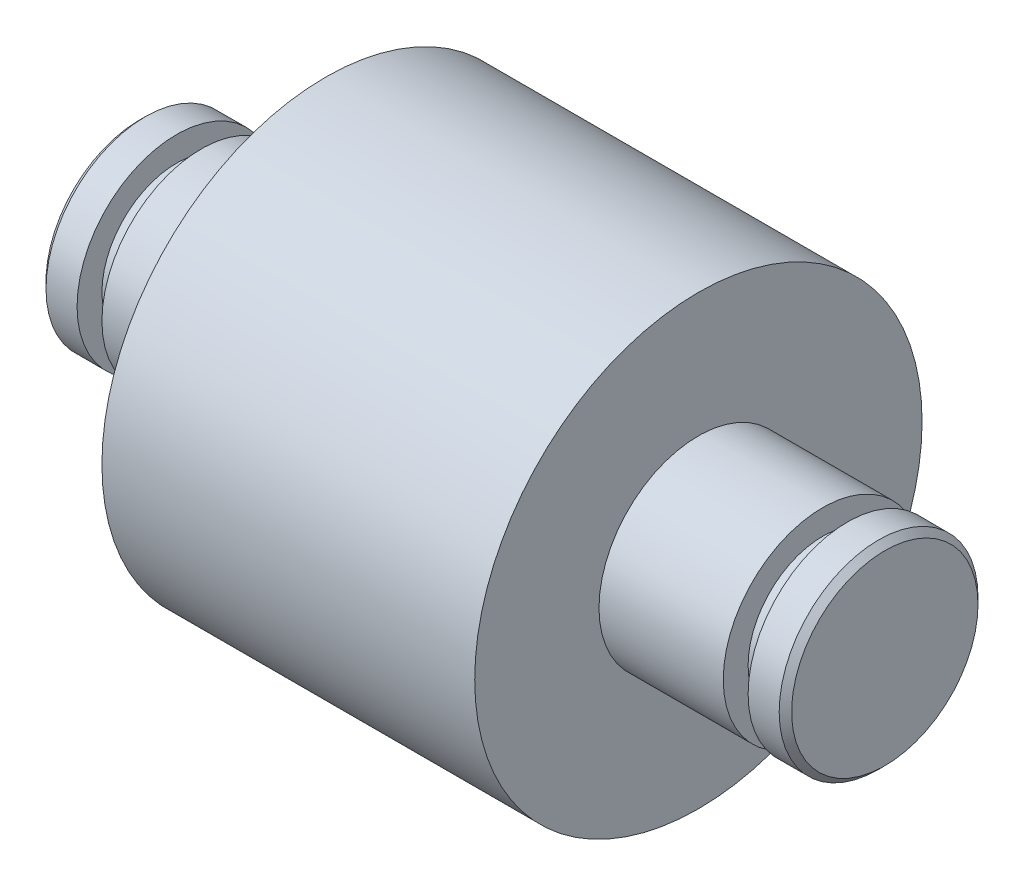
ISO-10303-21;
HEADER;
FILE_DESCRIPTION(('STEP AP214'),'2;1');
FILE_NAME('part.step','',(''),(''),'','','');
FILE_SCHEMA(('AUTOMOTIVE_DESIGN { 1 0 10303 214 1 1 1 1 }'));
ENDSEC;
DATA;
#1=APPLICATION_CONTEXT('core data for automotive mechanical design processes');
#2=APPLICATION_PROTOCOL_DEFINITION('international standard','automotive_design',2000,#1);
#3=PRODUCT_CONTEXT('',#1,'mechanical');
#4=PRODUCT('Part','Part','',(#3));
#5=PRODUCT_RELATED_PRODUCT_CATEGORY('part','',(#4));
#6=PRODUCT_DEFINITION_FORMATION('','',#4);
#7=PRODUCT_DEFINITION_CONTEXT('part definition',#1,'design');
#8=PRODUCT_DEFINITION('design','',#6,#7);
#9=PRODUCT_DEFINITION_SHAPE('','',#8);
#10=(LENGTH_UNIT() NAMED_UNIT(*) SI_UNIT(.MILLI.,.METRE.));
#11=(NAMED_UNIT(*) PLANE_ANGLE_UNIT() SI_UNIT($,.RADIAN.));
#12=(NAMED_UNIT(*) SI_UNIT($,.STERADIAN.) SOLID_ANGLE_UNIT());
#13=UNCERTAINTY_MEASURE_WITH_UNIT(LENGTH_MEASURE(1.E-05),#10,'distance_accuracy_value','');
#14=(GEOMETRIC_REPRESENTATION_CONTEXT(3) GLOBAL_UNCERTAINTY_ASSIGNED_CONTEXT((#13)) GLOBAL_UNIT_ASSIGNED_CONTEXT((#10,
#11,#12)) REPRESENTATION_CONTEXT('',''));
#15=CARTESIAN_POINT('',(0.,0.,0.));
#16=DIRECTION('',(0.,0.,1.));
#17=DIRECTION('',(1.,0.,0.));
#18=AXIS2_PLACEMENT_3D('',#15,#16,#17);
#19=CARTESIAN_POINT('',(15.,0.,0.));
#20=DIRECTION('',(1.,0.,0.));
#21=DIRECTION('',(0.,0.,-1.));
#22=AXIS2_PLACEMENT_3D('',#19,#20,#21);
#23=PLANE('',#22);
#24=CARTESIAN_POINT('',(15.,0.,0.));
#25=DIRECTION('',(1.,0.,0.));
#26=DIRECTION('',(0.,0.,-1.));
#27=AXIS2_PLACEMENT_3D('',#24,#25,#26);
#28=CIRCLE('',#27,3.75);
#29=CARTESIAN_POINT('',(15.,0.,-3.75));
#30=VERTEX_POINT('',#29);
#31=EDGE_CURVE('E10',#30,#30,#28,.T.);
#32=ORIENTED_EDGE('',*,*,#31,.T.);
#33=EDGE_LOOP('',(#32));
#34=FACE_BOUND('',#33,.T.);
#35=ADVANCED_FACE('F41',(#34),#23,.T.);
#36=CARTESIAN_POINT('',(-15.,0.,0.));
#37=DIRECTION('',(-1.,0.,0.));
#38=DIRECTION('',(0.,0.,1.));
#39=AXIS2_PLACEMENT_3D('',#36,#37,#38);
#40=CYLINDRICAL_SURFACE('',#39,4.);
#41=CARTESIAN_POINT('',(14.75,0.,0.));
#42=DIRECTION('',(1.,0.,0.));
#43=DIRECTION('',(0.,0.,-1.));
#44=AXIS2_PLACEMENT_3D('',#41,#42,#43);
#45=CIRCLE('',#44,4.);
#46=CARTESIAN_POINT('',(14.75,0.,-4.));
#47=VERTEX_POINT('',#46);
#48=EDGE_CURVE('E50',#47,#47,#45,.F.);
#49=ORIENTED_EDGE('',*,*,#48,.T.);
#50=EDGE_LOOP('',(#49));
#51=FACE_BOUND('',#50,.T.);
#52=CARTESIAN_POINT('',(13.5,0.,0.));
#53=DIRECTION('',(-1.,0.,0.));
#54=DIRECTION('',(0.,0.,1.));
#55=AXIS2_PLACEMENT_3D('',#52,#53,#54);
#56=CIRCLE('',#55,4.);
#57=CARTESIAN_POINT('',(13.5,0.,4.));
#58=VERTEX_POINT('',#57);
#59=EDGE_CURVE('E66',#58,#58,#56,.T.);
#60=ORIENTED_EDGE('',*,*,#59,.F.);
#61=EDGE_LOOP('',(#60));
#62=FACE_BOUND('',#61,.T.);
#63=ADVANCED_FACE('F133',(#51,#62),#40,.T.);
#64=CARTESIAN_POINT('',(13.5,0.,0.));
#65=DIRECTION('',(1.,0.,0.));
#66=DIRECTION('',(0.,0.,-1.));
#67=AXIS2_PLACEMENT_3D('',#64,#65,#66);
#68=PLANE('',#67);
#69=CARTESIAN_POINT('',(13.5,0.,0.));
#70=DIRECTION('',(-1.,0.,0.));
#71=DIRECTION('',(0.,0.,1.));
#72=AXIS2_PLACEMENT_3D('',#69,#70,#71);
#73=CIRCLE('',#72,2.99999999999999);
#74=CARTESIAN_POINT('',(13.5,0.,2.99999999999999));
#75=VERTEX_POINT('',#74);
#76=EDGE_CURVE('E70',#75,#75,#73,.T.);
#77=ORIENTED_EDGE('',*,*,#76,.F.);
#78=EDGE_LOOP('',(#77));
#79=FACE_BOUND('',#78,.T.);
#80=ORIENTED_EDGE('',*,*,#59,.T.);
#81=EDGE_LOOP('',(#80));
#82=FACE_BOUND('',#81,.T.);
#83=ADVANCED_FACE('F138',(#79,#82),#68,.F.);
#84=CARTESIAN_POINT('',(-15.,0.,0.));
#85=DIRECTION('',(-1.,0.,0.));
#86=DIRECTION('',(0.,0.,1.));
#87=AXIS2_PLACEMENT_3D('',#84,#85,#86);
#88=CYLINDRICAL_SURFACE('',#87,2.99999999999999);
#89=CARTESIAN_POINT('',(12.5,0.,0.));
#90=DIRECTION('',(-1.,0.,0.));
#91=DIRECTION('',(0.,0.,1.));
#92=AXIS2_PLACEMENT_3D('',#89,#90,#91);
#93=CIRCLE('',#92,2.99999999999999);
#94=CARTESIAN_POINT('',(12.5,0.,2.99999999999999));
#95=VERTEX_POINT('',#94);
#96=EDGE_CURVE('E74',#95,#95,#93,.T.);
#97=ORIENTED_EDGE('',*,*,#96,.F.);
#98=EDGE_LOOP('',(#97));
#99=FACE_BOUND('',#98,.T.);
#100=ORIENTED_EDGE('',*,*,#76,.T.);
#101=EDGE_LOOP('',(#100));
#102=FACE_BOUND('',#101,.T.);
#103=ADVANCED_FACE('F254',(#99,#102),#88,.T.);
#104=CARTESIAN_POINT('',(12.5,0.,0.));
#105=DIRECTION('',(1.,0.,0.));
#106=DIRECTION('',(0.,0.,-1.));
#107=AXIS2_PLACEMENT_3D('',#104,#105,#106);
#108=PLANE('',#107);
#109=ORIENTED_EDGE('',*,*,#96,.T.);
#110=EDGE_LOOP('',(#109));
#111=FACE_BOUND('',#110,.T.);
#112=CARTESIAN_POINT('',(12.5,0.,0.));
#113=DIRECTION('',(-1.,0.,0.));
#114=DIRECTION('',(0.,0.,1.));
#115=AXIS2_PLACEMENT_3D('',#112,#113,#114);
#116=CIRCLE('',#115,4.);
#117=CARTESIAN_POINT('',(12.5,0.,4.));
#118=VERTEX_POINT('',#117);
#119=EDGE_CURVE('E78',#118,#118,#116,.T.);
#120=ORIENTED_EDGE('',*,*,#119,.F.);
#121=EDGE_LOOP('',(#120));
#122=FACE_BOUND('',#121,.T.);
#123=ADVANCED_FACE('F244',(#111,#122),#108,.T.);
#124=CARTESIAN_POINT('',(-15.,0.,0.));
#125=DIRECTION('',(-1.,0.,0.));
#126=DIRECTION('',(0.,0.,1.));
#127=AXIS2_PLACEMENT_3D('',#124,#125,#126);
#128=CYLINDRICAL_SURFACE('',#127,4.);
#129=CARTESIAN_POINT('',(7.5,0.,0.));
#130=DIRECTION('',(-1.,0.,0.));
#131=DIRECTION('',(0.,0.,1.));
#132=AXIS2_PLACEMENT_3D('',#129,#130,#131);
#133=CIRCLE('',#132,4.);
#134=CARTESIAN_POINT('',(7.5,0.,4.));
#135=VERTEX_POINT('',#134);
#136=EDGE_CURVE('E82',#135,#135,#133,.T.);
#137=ORIENTED_EDGE('',*,*,#136,.F.);
#138=EDGE_LOOP('',(#137));
#139=FACE_BOUND('',#138,.T.);
#140=ORIENTED_EDGE('',*,*,#119,.T.);
#141=EDGE_LOOP('',(#140));
#142=FACE_BOUND('',#141,.T.);
#143=ADVANCED_FACE('F234',(#139,#142),#128,.T.);
#144=CARTESIAN_POINT('',(7.5,0.,0.));
#145=DIRECTION('',(1.,0.,0.));
#146=DIRECTION('',(0.,0.,-1.));
#147=AXIS2_PLACEMENT_3D('',#144,#145,#146);
#148=PLANE('',#147);
#149=ORIENTED_EDGE('',*,*,#136,.T.);
#150=EDGE_LOOP('',(#149));
#151=FACE_BOUND('',#150,.T.);
#152=CARTESIAN_POINT('',(7.5,0.,0.));
#153=DIRECTION('',(-1.,0.,0.));
#154=DIRECTION('',(0.,0.,1.));
#155=AXIS2_PLACEMENT_3D('',#152,#153,#154);
#156=CIRCLE('',#155,8.99999999999999);
#157=CARTESIAN_POINT('',(7.5,0.,8.99999999999999));
#158=VERTEX_POINT('',#157);
#159=EDGE_CURVE('E86',#158,#158,#156,.T.);
#160=ORIENTED_EDGE('',*,*,#159,.F.);
#161=EDGE_LOOP('',(#160));
#162=FACE_BOUND('',#161,.T.);
#163=ADVANCED_FACE('F224',(#151,#162),#148,.T.);
#164=CARTESIAN_POINT('',(-15.,0.,0.));
#165=DIRECTION('',(-1.,0.,0.));
#166=DIRECTION('',(0.,0.,1.));
#167=AXIS2_PLACEMENT_3D('',#164,#165,#166);
#168=CYLINDRICAL_SURFACE('',#167,8.99999999999999);
#169=ORIENTED_EDGE('',*,*,#159,.T.);
#170=EDGE_LOOP('',(#169));
#171=FACE_BOUND('',#170,.T.);
#172=CARTESIAN_POINT('',(-7.5,0.,0.));
#173=DIRECTION('',(-1.,0.,0.));
#174=DIRECTION('',(0.,0.,1.));
#175=AXIS2_PLACEMENT_3D('',#172,#173,#174);
#176=CIRCLE('',#175,8.99999999999999);
#177=CARTESIAN_POINT('',(-7.5,0.,8.99999999999999));
#178=VERTEX_POINT('',#177);
#179=EDGE_CURVE('E90',#178,#178,#176,.T.);
#180=ORIENTED_EDGE('',*,*,#179,.F.);
#181=EDGE_LOOP('',(#180));
#182=FACE_BOUND('',#181,.T.);
#183=ADVANCED_FACE('F214',(#171,#182),#168,.T.);
#184=CARTESIAN_POINT('',(-7.5,0.,0.));
#185=DIRECTION('',(1.,0.,0.));
#186=DIRECTION('',(0.,0.,-1.));
#187=AXIS2_PLACEMENT_3D('',#184,#185,#186);
#188=PLANE('',#187);
#189=CARTESIAN_POINT('',(-7.5,0.,0.));
#190=DIRECTION('',(-1.,0.,0.));
#191=DIRECTION('',(0.,0.,1.));
#192=AXIS2_PLACEMENT_3D('',#189,#190,#191);
#193=CIRCLE('',#192,4.);
#194=CARTESIAN_POINT('',(-7.5,0.,4.));
#195=VERTEX_POINT('',#194);
#196=EDGE_CURVE('E94',#195,#195,#193,.T.);
#197=ORIENTED_EDGE('',*,*,#196,.F.);
#198=EDGE_LOOP('',(#197));
#199=FACE_BOUND('',#198,.T.);
#200=ORIENTED_EDGE('',*,*,#179,.T.);
#201=EDGE_LOOP('',(#200));
#202=FACE_BOUND('',#201,.T.);
#203=ADVANCED_FACE('F204',(#199,#202),#188,.F.);
#204=CARTESIAN_POINT('',(-15.,0.,0.));
#205=DIRECTION('',(-1.,0.,0.));
#206=DIRECTION('',(0.,0.,1.));
#207=AXIS2_PLACEMENT_3D('',#204,#205,#206);
#208=CYLINDRICAL_SURFACE('',#207,4.);
#209=ORIENTED_EDGE('',*,*,#196,.T.);
#210=EDGE_LOOP('',(#209));
#211=FACE_BOUND('',#210,.T.);
#212=CARTESIAN_POINT('',(-12.5,0.,0.));
#213=DIRECTION('',(-1.,0.,0.));
#214=DIRECTION('',(0.,0.,1.));
#215=AXIS2_PLACEMENT_3D('',#212,#213,#214);
#216=CIRCLE('',#215,4.);
#217=CARTESIAN_POINT('',(-12.5,0.,4.));
#218=VERTEX_POINT('',#217);
#219=EDGE_CURVE('E98',#218,#218,#216,.T.);
#220=ORIENTED_EDGE('',*,*,#219,.F.);
#221=EDGE_LOOP('',(#220));
#222=FACE_BOUND('',#221,.T.);
#223=ADVANCED_FACE('F194',(#211,#222),#208,.T.);
#224=CARTESIAN_POINT('',(-12.5,0.,0.));
#225=DIRECTION('',(1.,0.,0.));
#226=DIRECTION('',(0.,0.,-1.));
#227=AXIS2_PLACEMENT_3D('',#224,#225,#226);
#228=PLANE('',#227);
#229=CARTESIAN_POINT('',(-12.5,0.,0.));
#230=DIRECTION('',(-1.,0.,0.));
#231=DIRECTION('',(0.,0.,1.));
#232=AXIS2_PLACEMENT_3D('',#229,#230,#231);
#233=CIRCLE('',#232,2.99999999999999);
#234=CARTESIAN_POINT('',(-12.5,0.,2.99999999999999));
#235=VERTEX_POINT('',#234);
#236=EDGE_CURVE('E102',#235,#235,#233,.T.);
#237=ORIENTED_EDGE('',*,*,#236,.F.);
#238=EDGE_LOOP('',(#237));
#239=FACE_BOUND('',#238,.T.);
#240=ORIENTED_EDGE('',*,*,#219,.T.);
#241=EDGE_LOOP('',(#240));
#242=FACE_BOUND('',#241,.T.);
#243=ADVANCED_FACE('F129',(#239,#242),#228,.F.);
#244=CARTESIAN_POINT('',(-15.,0.,0.));
#245=DIRECTION('',(-1.,0.,0.));
#246=DIRECTION('',(0.,0.,1.));
#247=AXIS2_PLACEMENT_3D('',#244,#245,#246);
#248=CYLINDRICAL_SURFACE('',#247,2.99999999999999);
#249=ORIENTED_EDGE('',*,*,#236,.T.);
#250=EDGE_LOOP('',(#249));
#251=FACE_BOUND('',#250,.T.);
#252=CARTESIAN_POINT('',(-13.5,0.,0.));
#253=DIRECTION('',(-1.,0.,0.));
#254=DIRECTION('',(0.,0.,1.));
#255=AXIS2_PLACEMENT_3D('',#252,#253,#254);
#256=CIRCLE('',#255,2.99999999999999);
#257=CARTESIAN_POINT('',(-13.5,0.,2.99999999999999));
#258=VERTEX_POINT('',#257);
#259=EDGE_CURVE('E106',#258,#258,#256,.T.);
#260=ORIENTED_EDGE('',*,*,#259,.F.);
#261=EDGE_LOOP('',(#260));
#262=FACE_BOUND('',#261,.T.);
#263=ADVANCED_FACE('F119',(#251,#262),#248,.T.);
#264=CARTESIAN_POINT('',(-13.5,0.,0.));
#265=DIRECTION('',(1.,0.,0.));
#266=DIRECTION('',(0.,0.,-1.));
#267=AXIS2_PLACEMENT_3D('',#264,#265,#266);
#268=PLANE('',#267);
#269=ORIENTED_EDGE('',*,*,#259,.T.);
#270=EDGE_LOOP('',(#269));
#271=FACE_BOUND('',#270,.T.);
#272=CARTESIAN_POINT('',(-13.5,0.,0.));
#273=DIRECTION('',(-1.,0.,0.));
#274=DIRECTION('',(0.,0.,1.));
#275=AXIS2_PLACEMENT_3D('',#272,#273,#274);
#276=CIRCLE('',#275,4.);
#277=CARTESIAN_POINT('',(-13.5,0.,4.));
#278=VERTEX_POINT('',#277);
#279=EDGE_CURVE('E110',#278,#278,#276,.T.);
#280=ORIENTED_EDGE('',*,*,#279,.F.);
#281=EDGE_LOOP('',(#280));
#282=FACE_BOUND('',#281,.T.);
#283=ADVANCED_FACE('F117',(#271,#282),#268,.T.);
#284=CARTESIAN_POINT('',(-15.,0.,0.));
#285=DIRECTION('',(-1.,0.,0.));
#286=DIRECTION('',(0.,0.,1.));
#287=AXIS2_PLACEMENT_3D('',#284,#285,#286);
#288=CYLINDRICAL_SURFACE('',#287,4.);
#289=CARTESIAN_POINT('',(-14.75,0.,0.));
#290=DIRECTION('',(1.,0.,0.));
#291=DIRECTION('',(0.,0.,-1.));
#292=AXIS2_PLACEMENT_3D('',#289,#290,#291);
#293=CIRCLE('',#292,4.);
#294=CARTESIAN_POINT('',(-14.75,0.,-4.));
#295=VERTEX_POINT('',#294);
#296=EDGE_CURVE('E55',#295,#295,#293,.T.);
#297=ORIENTED_EDGE('',*,*,#296,.T.);
#298=EDGE_LOOP('',(#297));
#299=FACE_BOUND('',#298,.T.);
#300=ORIENTED_EDGE('',*,*,#279,.T.);
#301=EDGE_LOOP('',(#300));
#302=FACE_BOUND('',#301,.T.);
#303=ADVANCED_FACE('F115',(#299,#302),#288,.T.);
#304=CARTESIAN_POINT('',(-15.,0.,0.));
#305=DIRECTION('',(1.,0.,0.));
#306=DIRECTION('',(0.,0.,-1.));
#307=AXIS2_PLACEMENT_3D('',#304,#305,#306);
#308=PLANE('',#307);
#309=CARTESIAN_POINT('',(-15.,0.,0.));
#310=DIRECTION('',(1.,0.,0.));
#311=DIRECTION('',(0.,0.,-1.));
#312=AXIS2_PLACEMENT_3D('',#309,#310,#311);
#313=CIRCLE('',#312,3.75);
#314=CARTESIAN_POINT('',(-15.,0.,-3.75));
#315=VERTEX_POINT('',#314);
#316=EDGE_CURVE('E60',#315,#315,#313,.F.);
#317=ORIENTED_EDGE('',*,*,#316,.T.);
#318=EDGE_LOOP('',(#317));
#319=FACE_BOUND('',#318,.T.);
#320=ADVANCED_FACE('F126',(#319),#308,.F.);
#321=CARTESIAN_POINT('',(-15.,0.,0.));
#322=DIRECTION('',(1.,0.,0.));
#323=DIRECTION('',(0.,0.,-1.));
#324=AXIS2_PLACEMENT_3D('',#321,#322,#323);
#325=CONICAL_SURFACE('',#324,3.75,0.785398163397435);
#326=ORIENTED_EDGE('',*,*,#296,.F.);
#327=EDGE_LOOP('',(#326));
#328=FACE_BOUND('',#327,.T.);
#329=ORIENTED_EDGE('',*,*,#316,.F.);
#330=EDGE_LOOP('',(#329));
#331=FACE_BOUND('',#330,.T.);
#332=ADVANCED_FACE('F142',(#328,#331),#325,.T.);
#333=CARTESIAN_POINT('',(14.75,0.,0.));
#334=DIRECTION('',(-1.,0.,0.));
#335=DIRECTION('',(0.,0.,1.));
#336=AXIS2_PLACEMENT_3D('',#333,#334,#335);
#337=CONICAL_SURFACE('',#336,4.,0.785398163397455);
#338=ORIENTED_EDGE('',*,*,#31,.F.);
#339=EDGE_LOOP('',(#338));
#340=FACE_BOUND('',#339,.T.);
#341=ORIENTED_EDGE('',*,*,#48,.F.);
#342=EDGE_LOOP('',(#341));
#343=FACE_BOUND('',#342,.T.);
#344=ADVANCED_FACE('F44',(#340,#343),#337,.T.);
#345=CLOSED_SHELL('',(#35,#63,#83,#103,#123,#143,#163,#183,#203,#223,#243,#263,#283,#303,#320,
#332,#344));
#346=MANIFOLD_SOLID_BREP('B2',#345);
#347=ADVANCED_BREP_SHAPE_REPRESENTATION('',(#18,#346),#14);
#348=SHAPE_DEFINITION_REPRESENTATION(#9,#347);
ENDSEC;
END-ISO-10303-21;
